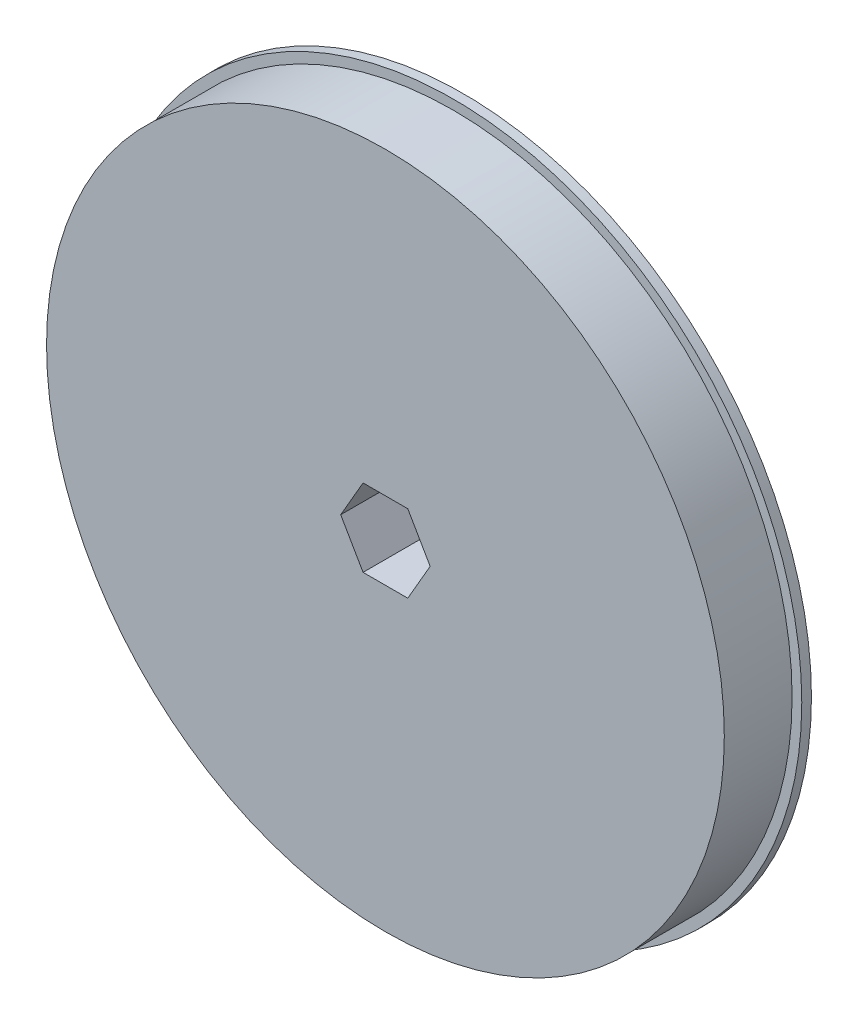
ISO-10303-21;
HEADER;
FILE_DESCRIPTION(('STEP AP214'),'2;1');
FILE_NAME('part.step','',(''),(''),'','','');
FILE_SCHEMA(('AUTOMOTIVE_DESIGN { 1 0 10303 214 1 1 1 1 }'));
ENDSEC;
DATA;
#1=APPLICATION_CONTEXT('core data for automotive mechanical design processes');
#2=APPLICATION_PROTOCOL_DEFINITION('international standard','automotive_design',2000,#1);
#3=PRODUCT_CONTEXT('',#1,'mechanical');
#4=PRODUCT('Part','Part','',(#3));
#5=PRODUCT_RELATED_PRODUCT_CATEGORY('part','',(#4));
#6=PRODUCT_DEFINITION_FORMATION('','',#4);
#7=PRODUCT_DEFINITION_CONTEXT('part definition',#1,'design');
#8=PRODUCT_DEFINITION('design','',#6,#7);
#9=PRODUCT_DEFINITION_SHAPE('','',#8);
#10=(LENGTH_UNIT() NAMED_UNIT(*) SI_UNIT(.MILLI.,.METRE.));
#11=(NAMED_UNIT(*) PLANE_ANGLE_UNIT() SI_UNIT($,.RADIAN.));
#12=(NAMED_UNIT(*) SI_UNIT($,.STERADIAN.) SOLID_ANGLE_UNIT());
#13=UNCERTAINTY_MEASURE_WITH_UNIT(LENGTH_MEASURE(1.E-05),#10,'distance_accuracy_value','');
#14=(GEOMETRIC_REPRESENTATION_CONTEXT(3) GLOBAL_UNCERTAINTY_ASSIGNED_CONTEXT((#13)) GLOBAL_UNIT_ASSIGNED_CONTEXT((#10,
#11,#12)) REPRESENTATION_CONTEXT('',''));
#15=CARTESIAN_POINT('',(0.,0.,0.));
#16=DIRECTION('',(0.,0.,1.));
#17=DIRECTION('',(1.,0.,0.));
#18=AXIS2_PLACEMENT_3D('',#15,#16,#17);
#19=CARTESIAN_POINT('',(0.,0.,9.525));
#20=DIRECTION('',(0.,0.,-1.));
#21=DIRECTION('',(-1.,0.,0.));
#22=AXIS2_PLACEMENT_3D('',#19,#20,#21);
#23=PLANE('',#22);
#24=CARTESIAN_POINT('',(0.,0.,9.525));
#25=DIRECTION('',(0.,0.,-1.));
#26=DIRECTION('',(-1.,0.,0.));
#27=AXIS2_PLACEMENT_3D('',#24,#25,#26);
#28=CIRCLE('',#27,50.8);
#29=CARTESIAN_POINT('',(-50.8,0.,9.525));
#30=VERTEX_POINT('',#29);
#31=EDGE_CURVE('E142',#30,#30,#28,.T.);
#32=ORIENTED_EDGE('',*,*,#31,.T.);
#33=EDGE_LOOP('',(#32));
#34=FACE_BOUND('',#33,.T.);
#35=CARTESIAN_POINT('',(0.,0.,9.525));
#36=DIRECTION('',(0.,0.,-1.));
#37=DIRECTION('',(-1.,0.,0.));
#38=AXIS2_PLACEMENT_3D('',#35,#36,#37);
#39=CIRCLE('',#38,12.7);
#40=CARTESIAN_POINT('',(12.7,0.,9.525));
#41=VERTEX_POINT('',#40);
#42=EDGE_CURVE('E131',#41,#41,#39,.T.);
#43=ORIENTED_EDGE('',*,*,#42,.F.);
#44=EDGE_LOOP('',(#43));
#45=FACE_BOUND('',#44,.T.);
#46=ADVANCED_FACE('F33',(#34,#45),#23,.T.);
#47=CARTESIAN_POINT('',(0.,0.,12.7));
#48=DIRECTION('',(0.,0.,-1.));
#49=DIRECTION('',(-1.,0.,0.));
#50=AXIS2_PLACEMENT_3D('',#47,#48,#49);
#51=CYLINDRICAL_SURFACE('',#50,57.15);
#52=CARTESIAN_POINT('',(0.,0.,0.));
#53=DIRECTION('',(0.,0.,1.));
#54=DIRECTION('',(1.,0.,0.));
#55=AXIS2_PLACEMENT_3D('',#52,#53,#54);
#56=CIRCLE('',#55,57.15);
#57=CARTESIAN_POINT('',(57.15,0.,0.));
#58=VERTEX_POINT('',#57);
#59=EDGE_CURVE('E156',#58,#58,#56,.T.);
#60=ORIENTED_EDGE('',*,*,#59,.T.);
#61=EDGE_LOOP('',(#60));
#62=FACE_BOUND('',#61,.T.);
#63=CARTESIAN_POINT('',(0.,0.,1.5875));
#64=DIRECTION('',(0.,0.,1.));
#65=DIRECTION('',(1.,0.,0.));
#66=AXIS2_PLACEMENT_3D('',#63,#64,#65);
#67=CIRCLE('',#66,57.15);
#68=CARTESIAN_POINT('',(57.15,0.,1.5875));
#69=VERTEX_POINT('',#68);
#70=EDGE_CURVE('E151',#69,#69,#67,.T.);
#71=ORIENTED_EDGE('',*,*,#70,.F.);
#72=EDGE_LOOP('',(#71));
#73=FACE_BOUND('',#72,.T.);
#74=ADVANCED_FACE('F173',(#62,#73),#51,.T.);
#75=CARTESIAN_POINT('',(0.,0.,0.));
#76=DIRECTION('',(0.,0.,1.));
#77=DIRECTION('',(1.,0.,0.));
#78=AXIS2_PLACEMENT_3D('',#75,#76,#77);
#79=PLANE('',#78);
#80=CARTESIAN_POINT('',(0.,0.,0.));
#81=DIRECTION('',(0.,0.,-1.));
#82=DIRECTION('',(-1.,0.,0.));
#83=AXIS2_PLACEMENT_3D('',#80,#81,#82);
#84=CIRCLE('',#83,50.8);
#85=CARTESIAN_POINT('',(-50.8,0.,0.));
#86=VERTEX_POINT('',#85);
#87=EDGE_CURVE('E141',#86,#86,#84,.T.);
#88=ORIENTED_EDGE('',*,*,#87,.F.);
#89=EDGE_LOOP('',(#88));
#90=FACE_BOUND('',#89,.T.);
#91=ORIENTED_EDGE('',*,*,#59,.F.);
#92=EDGE_LOOP('',(#91));
#93=FACE_BOUND('',#92,.T.);
#94=ADVANCED_FACE('F179',(#90,#93),#79,.F.);
#95=CARTESIAN_POINT('',(0.,0.,1.5875));
#96=DIRECTION('',(0.,0.,1.));
#97=DIRECTION('',(1.,0.,0.));
#98=AXIS2_PLACEMENT_3D('',#95,#96,#97);
#99=PLANE('',#98);
#100=CARTESIAN_POINT('',(0.,0.,1.5875));
#101=DIRECTION('',(0.,0.,1.));
#102=DIRECTION('',(1.,0.,0.));
#103=AXIS2_PLACEMENT_3D('',#100,#101,#102);
#104=CIRCLE('',#103,55.5625);
#105=CARTESIAN_POINT('',(55.5625,0.,1.5875));
#106=VERTEX_POINT('',#105);
#107=EDGE_CURVE('E148',#106,#106,#104,.T.);
#108=ORIENTED_EDGE('',*,*,#107,.F.);
#109=EDGE_LOOP('',(#108));
#110=FACE_BOUND('',#109,.T.);
#111=ORIENTED_EDGE('',*,*,#70,.T.);
#112=EDGE_LOOP('',(#111));
#113=FACE_BOUND('',#112,.T.);
#114=ADVANCED_FACE('F193',(#110,#113),#99,.T.);
#115=CARTESIAN_POINT('',(0.,0.,1.5875));
#116=DIRECTION('',(0.,0.,1.));
#117=DIRECTION('',(1.,0.,0.));
#118=AXIS2_PLACEMENT_3D('',#115,#116,#117);
#119=CYLINDRICAL_SURFACE('',#118,55.5625);
#120=ORIENTED_EDGE('',*,*,#107,.T.);
#121=EDGE_LOOP('',(#120));
#122=FACE_BOUND('',#121,.T.);
#123=CARTESIAN_POINT('',(0.,0.,12.7));
#124=DIRECTION('',(0.,0.,1.));
#125=DIRECTION('',(1.,0.,0.));
#126=AXIS2_PLACEMENT_3D('',#123,#124,#125);
#127=CIRCLE('',#126,55.5625);
#128=CARTESIAN_POINT('',(55.5625,0.,12.7));
#129=VERTEX_POINT('',#128);
#130=EDGE_CURVE('E145',#129,#129,#127,.T.);
#131=ORIENTED_EDGE('',*,*,#130,.F.);
#132=EDGE_LOOP('',(#131));
#133=FACE_BOUND('',#132,.T.);
#134=ADVANCED_FACE('F190',(#122,#133),#119,.T.);
#135=CARTESIAN_POINT('',(0.,0.,12.7));
#136=DIRECTION('',(0.,0.,1.));
#137=DIRECTION('',(1.,0.,0.));
#138=AXIS2_PLACEMENT_3D('',#135,#136,#137);
#139=PLANE('',#138);
#140=DIRECTION('',(-0.5,0.866025403784439,0.));
#141=VECTOR('',#140,1.);
#142=CARTESIAN_POINT('',(-3.66617420935412,-6.35,12.7));
#143=LINE('',#142,#141);
#144=CARTESIAN_POINT('',(-3.66617420935412,-6.35,12.7));
#145=VERTEX_POINT('',#144);
#146=CARTESIAN_POINT('',(-7.33234841870825,0.,12.7));
#147=VERTEX_POINT('',#146);
#148=EDGE_CURVE('E88',#145,#147,#143,.T.);
#149=ORIENTED_EDGE('',*,*,#148,.T.);
#150=DIRECTION('',(0.5,0.866025403784439,0.));
#151=VECTOR('',#150,1.);
#152=CARTESIAN_POINT('',(-7.33234841870825,0.,12.7));
#153=LINE('',#152,#151);
#154=CARTESIAN_POINT('',(-3.66617420935412,6.35,12.7));
#155=VERTEX_POINT('',#154);
#156=EDGE_CURVE('E97',#147,#155,#153,.T.);
#157=ORIENTED_EDGE('',*,*,#156,.T.);
#158=DIRECTION('',(1.,0.,0.));
#159=VECTOR('',#158,1.);
#160=CARTESIAN_POINT('',(-3.66617420935412,6.35,12.7));
#161=LINE('',#160,#159);
#162=CARTESIAN_POINT('',(3.66617420935412,6.35000000000001,12.7));
#163=VERTEX_POINT('',#162);
#164=EDGE_CURVE('E48',#155,#163,#161,.T.);
#165=ORIENTED_EDGE('',*,*,#164,.T.);
#166=DIRECTION('',(0.5,-0.866025403784439,0.));
#167=VECTOR('',#166,1.);
#168=CARTESIAN_POINT('',(3.66617420935412,6.35000000000001,12.7));
#169=LINE('',#168,#167);
#170=CARTESIAN_POINT('',(7.33234841870825,0.,12.7));
#171=VERTEX_POINT('',#170);
#172=EDGE_CURVE('E112',#163,#171,#169,.T.);
#173=ORIENTED_EDGE('',*,*,#172,.T.);
#174=DIRECTION('',(-0.5,-0.866025403784439,0.));
#175=VECTOR('',#174,1.);
#176=CARTESIAN_POINT('',(7.33234841870825,0.,12.7));
#177=LINE('',#176,#175);
#178=CARTESIAN_POINT('',(3.66617420935413,-6.35,12.7));
#179=VERTEX_POINT('',#178);
#180=EDGE_CURVE('E115',#171,#179,#177,.T.);
#181=ORIENTED_EDGE('',*,*,#180,.T.);
#182=DIRECTION('',(-1.,0.,0.));
#183=VECTOR('',#182,1.);
#184=CARTESIAN_POINT('',(3.66617420935413,-6.35,12.7));
#185=LINE('',#184,#183);
#186=EDGE_CURVE('E94',#179,#145,#185,.T.);
#187=ORIENTED_EDGE('',*,*,#186,.T.);
#188=EDGE_LOOP('',(#149,#157,#165,#173,#181,#187));
#189=FACE_BOUND('',#188,.T.);
#190=ORIENTED_EDGE('',*,*,#130,.T.);
#191=EDGE_LOOP('',(#190));
#192=FACE_BOUND('',#191,.T.);
#193=ADVANCED_FACE('F101',(#189,#192),#139,.T.);
#194=CARTESIAN_POINT('',(0.,0.,9.525));
#195=DIRECTION('',(0.,0.,-1.));
#196=DIRECTION('',(-1.,0.,0.));
#197=AXIS2_PLACEMENT_3D('',#194,#195,#196);
#198=CYLINDRICAL_SURFACE('',#197,50.8);
#199=CARTESIAN_POINT('',(-50.8,0.,9.525));
#200=CARTESIAN_POINT('',(-50.8,0.,9.42578125));
#201=CARTESIAN_POINT('',(-50.8,0.,9.3265625));
#202=CARTESIAN_POINT('',(-50.8,0.,9.128125));
#203=CARTESIAN_POINT('',(-50.8,0.,9.02890625));
#204=CARTESIAN_POINT('',(-50.8,0.,8.83046875));
#205=CARTESIAN_POINT('',(-50.8,0.,8.73125));
#206=CARTESIAN_POINT('',(-50.8,0.,8.5328125));
#207=CARTESIAN_POINT('',(-50.8,0.,8.43359375));
#208=CARTESIAN_POINT('',(-50.8,0.,8.23515625));
#209=CARTESIAN_POINT('',(-50.8,0.,8.1359375));
#210=CARTESIAN_POINT('',(-50.8,0.,7.9375));
#211=CARTESIAN_POINT('',(-50.8,0.,7.83828125));
#212=CARTESIAN_POINT('',(-50.8,0.,7.63984375));
#213=CARTESIAN_POINT('',(-50.8,0.,7.540625));
#214=CARTESIAN_POINT('',(-50.8,0.,7.3421875));
#215=CARTESIAN_POINT('',(-50.8,0.,7.24296875));
#216=CARTESIAN_POINT('',(-50.8,0.,7.04453125));
#217=CARTESIAN_POINT('',(-50.8,0.,6.9453125));
#218=CARTESIAN_POINT('',(-50.8,0.,6.746875));
#219=CARTESIAN_POINT('',(-50.8,0.,6.64765625));
#220=CARTESIAN_POINT('',(-50.8,0.,6.44921875));
#221=CARTESIAN_POINT('',(-50.8,0.,6.35));
#222=CARTESIAN_POINT('',(-50.8,0.,6.1515625));
#223=CARTESIAN_POINT('',(-50.8,0.,6.05234375));
#224=CARTESIAN_POINT('',(-50.8,0.,5.85390625));
#225=CARTESIAN_POINT('',(-50.8,0.,5.7546875));
#226=CARTESIAN_POINT('',(-50.8,0.,5.55625));
#227=CARTESIAN_POINT('',(-50.8,0.,5.45703125));
#228=CARTESIAN_POINT('',(-50.8,0.,5.25859375));
#229=CARTESIAN_POINT('',(-50.8,0.,5.159375));
#230=CARTESIAN_POINT('',(-50.8,0.,4.9609375));
#231=CARTESIAN_POINT('',(-50.8,0.,4.86171875));
#232=CARTESIAN_POINT('',(-50.8,0.,4.66328125));
#233=CARTESIAN_POINT('',(-50.8,0.,4.5640625));
#234=CARTESIAN_POINT('',(-50.8,0.,4.365625));
#235=CARTESIAN_POINT('',(-50.8,0.,4.26640625));
#236=CARTESIAN_POINT('',(-50.8,0.,4.06796875));
#237=CARTESIAN_POINT('',(-50.8,0.,3.96875));
#238=CARTESIAN_POINT('',(-50.8,0.,3.7703125));
#239=CARTESIAN_POINT('',(-50.8,0.,3.67109375));
#240=CARTESIAN_POINT('',(-50.8,0.,3.47265625));
#241=CARTESIAN_POINT('',(-50.8,0.,3.3734375));
#242=CARTESIAN_POINT('',(-50.8,0.,3.175));
#243=CARTESIAN_POINT('',(-50.8,0.,3.07578125));
#244=CARTESIAN_POINT('',(-50.8,0.,2.87734375));
#245=CARTESIAN_POINT('',(-50.8,0.,2.778125));
#246=CARTESIAN_POINT('',(-50.8,0.,2.5796875));
#247=CARTESIAN_POINT('',(-50.8,0.,2.48046875));
#248=CARTESIAN_POINT('',(-50.8,0.,2.28203125));
#249=CARTESIAN_POINT('',(-50.8,0.,2.1828125));
#250=CARTESIAN_POINT('',(-50.8,0.,1.984375));
#251=CARTESIAN_POINT('',(-50.8,0.,1.88515625));
#252=CARTESIAN_POINT('',(-50.8,0.,1.68671875));
#253=CARTESIAN_POINT('',(-50.8,0.,1.5875));
#254=CARTESIAN_POINT('',(-50.8,0.,1.3890625));
#255=CARTESIAN_POINT('',(-50.8,0.,1.28984375));
#256=CARTESIAN_POINT('',(-50.8,0.,1.09140625));
#257=CARTESIAN_POINT('',(-50.8,0.,0.992187500000001));
#258=CARTESIAN_POINT('',(-50.8,0.,0.793750000000001));
#259=CARTESIAN_POINT('',(-50.8,0.,0.69453125));
#260=CARTESIAN_POINT('',(-50.8,0.,0.49609375));
#261=CARTESIAN_POINT('',(-50.8,0.,0.396875));
#262=CARTESIAN_POINT('',(-50.8,0.,0.1984375));
#263=CARTESIAN_POINT('',(-50.8,0.,0.0992187500000001));
#264=CARTESIAN_POINT('',(-50.8,0.,0.));
#265=B_SPLINE_CURVE_WITH_KNOTS('',3,(#199,#200,#201,#202,#203,#204,#205,#206,#207,#208,#209,
#210,#211,#212,#213,#214,#215,#216,#217,#218,#219,#220,#221,#222,#223,#224,#225,#226,#227,#228,
#229,#230,#231,#232,#233,#234,#235,#236,#237,#238,#239,#240,#241,#242,#243,#244,#245,#246,#247,
#248,#249,#250,#251,#252,#253,#254,#255,#256,#257,#258,#259,#260,#261,#262,#263,#264),
.UNSPECIFIED.,.F.,.F.,(4,2,2,2,2,2,2,2,2,2,2,2,2,2,2,2,2,2,2,2,2,2,2,2,2,2,2,2,2,2,2,2,4),(0.,
0.29765625,0.5953125,0.892968750000001,1.190625,1.48828125,1.7859375,2.08359375,2.38125,
2.67890625,2.9765625,3.27421875,3.571875,3.86953125,4.1671875,4.46484375,4.7625,5.06015625,
5.3578125,5.65546875,5.953125,6.25078125,6.5484375,6.84609375,7.14375,7.44140625,7.7390625,
8.03671875,8.334375,8.63203125,8.9296875,9.22734375,9.525),.UNSPECIFIED.);
#266=EDGE_CURVE('BSEAM186',#30,#86,#265,.T.);
#267=ORIENTED_EDGE('',*,*,#31,.F.);
#268=ORIENTED_EDGE('',*,*,#87,.T.);
#269=ORIENTED_EDGE('',*,*,#266,.T.);
#270=ORIENTED_EDGE('',*,*,#266,.F.);
#271=EDGE_LOOP('',(#267,#269,#268,#270));
#272=FACE_BOUND('',#271,.T.);
#273=ADVANCED_FACE('F186',(#272),#198,.F.);
#274=CARTESIAN_POINT('',(0.,0.,0.));
#275=DIRECTION('',(0.,0.,1.));
#276=DIRECTION('',(1.,0.,0.));
#277=AXIS2_PLACEMENT_3D('',#274,#275,#276);
#278=CYLINDRICAL_SURFACE('',#277,12.7);
#279=CARTESIAN_POINT('',(0.,0.,0.793749999999937));
#280=DIRECTION('',(0.,0.,-1.));
#281=DIRECTION('',(-1.,0.,0.));
#282=AXIS2_PLACEMENT_3D('',#279,#280,#281);
#283=CIRCLE('',#282,12.7);
#284=CARTESIAN_POINT('',(12.7,0.,0.793749999999937));
#285=VERTEX_POINT('',#284);
#286=EDGE_CURVE('E11',#285,#285,#283,.F.);
#287=CARTESIAN_POINT('',(12.7,0.,0.793749999999937));
#288=CARTESIAN_POINT('',(12.7,0.,0.884700520833271));
#289=CARTESIAN_POINT('',(12.7,0.,0.975651041666605));
#290=CARTESIAN_POINT('',(12.7,0.,1.15755208333327));
#291=CARTESIAN_POINT('',(12.7,0.,1.24850260416661));
#292=CARTESIAN_POINT('',(12.7,0.,1.43040364583327));
#293=CARTESIAN_POINT('',(12.7,0.,1.52135416666661));
#294=CARTESIAN_POINT('',(12.7,0.,1.70325520833328));
#295=CARTESIAN_POINT('',(12.7,0.,1.79420572916661));
#296=CARTESIAN_POINT('',(12.7,0.,1.97610677083328));
#297=CARTESIAN_POINT('',(12.7,0.,2.06705729166661));
#298=CARTESIAN_POINT('',(12.7,0.,2.24895833333328));
#299=CARTESIAN_POINT('',(12.7,0.,2.33990885416662));
#300=CARTESIAN_POINT('',(12.7,0.,2.52180989583328));
#301=CARTESIAN_POINT('',(12.7,0.,2.61276041666662));
#302=CARTESIAN_POINT('',(12.7,0.,2.79466145833328));
#303=CARTESIAN_POINT('',(12.7,0.,2.88561197916662));
#304=CARTESIAN_POINT('',(12.7,0.,3.06751302083329));
#305=CARTESIAN_POINT('',(12.7,0.,3.15846354166662));
#306=CARTESIAN_POINT('',(12.7,0.,3.34036458333329));
#307=CARTESIAN_POINT('',(12.7,0.,3.43131510416662));
#308=CARTESIAN_POINT('',(12.7,0.,3.61321614583329));
#309=CARTESIAN_POINT('',(12.7,0.,3.70416666666663));
#310=CARTESIAN_POINT('',(12.7,0.,3.88606770833329));
#311=CARTESIAN_POINT('',(12.7,0.,3.97701822916663));
#312=CARTESIAN_POINT('',(12.7,0.,4.15891927083329));
#313=CARTESIAN_POINT('',(12.7,0.,4.24986979166663));
#314=CARTESIAN_POINT('',(12.7,0.,4.4317708333333));
#315=CARTESIAN_POINT('',(12.7,0.,4.52272135416663));
#316=CARTESIAN_POINT('',(12.7,0.,4.7046223958333));
#317=CARTESIAN_POINT('',(12.7,0.,4.79557291666663));
#318=CARTESIAN_POINT('',(12.7,0.,4.9774739583333));
#319=CARTESIAN_POINT('',(12.7,0.,5.06842447916663));
#320=CARTESIAN_POINT('',(12.7,0.,5.2503255208333));
#321=CARTESIAN_POINT('',(12.7,0.,5.34127604166664));
#322=CARTESIAN_POINT('',(12.7,0.,5.52317708333331));
#323=CARTESIAN_POINT('',(12.7,0.,5.61412760416664));
#324=CARTESIAN_POINT('',(12.7,0.,5.79602864583331));
#325=CARTESIAN_POINT('',(12.7,0.,5.88697916666664));
#326=CARTESIAN_POINT('',(12.7,0.,6.06888020833331));
#327=CARTESIAN_POINT('',(12.7,0.,6.15983072916664));
#328=CARTESIAN_POINT('',(12.7,0.,6.34173177083331));
#329=CARTESIAN_POINT('',(12.7,0.,6.43268229166665));
#330=CARTESIAN_POINT('',(12.7,0.,6.61458333333331));
#331=CARTESIAN_POINT('',(12.7,0.,6.70553385416665));
#332=CARTESIAN_POINT('',(12.7,0.,6.88743489583331));
#333=CARTESIAN_POINT('',(12.7,0.,6.97838541666665));
#334=CARTESIAN_POINT('',(12.7,0.,7.16028645833332));
#335=CARTESIAN_POINT('',(12.7,0.,7.25123697916665));
#336=CARTESIAN_POINT('',(12.7,0.,7.43313802083332));
#337=CARTESIAN_POINT('',(12.7,0.,7.52408854166665));
#338=CARTESIAN_POINT('',(12.7,0.,7.70598958333332));
#339=CARTESIAN_POINT('',(12.7,0.,7.79694010416666));
#340=CARTESIAN_POINT('',(12.7,0.,7.97884114583332));
#341=CARTESIAN_POINT('',(12.7,0.,8.06979166666666));
#342=CARTESIAN_POINT('',(12.7,0.,8.25169270833332));
#343=CARTESIAN_POINT('',(12.7,0.,8.34264322916666));
#344=CARTESIAN_POINT('',(12.7,0.,8.52454427083333));
#345=CARTESIAN_POINT('',(12.7,0.,8.61549479166666));
#346=CARTESIAN_POINT('',(12.7,0.,8.79739583333333));
#347=CARTESIAN_POINT('',(12.7,0.,8.88834635416666));
#348=CARTESIAN_POINT('',(12.7,0.,9.07024739583333));
#349=CARTESIAN_POINT('',(12.7,0.,9.16119791666666));
#350=CARTESIAN_POINT('',(12.7,0.,9.34309895833333));
#351=CARTESIAN_POINT('',(12.7,0.,9.43404947916667));
#352=CARTESIAN_POINT('',(12.7,0.,9.525));
#353=B_SPLINE_CURVE_WITH_KNOTS('',3,(#287,#288,#289,#290,#291,#292,#293,#294,#295,#296,#297,
#298,#299,#300,#301,#302,#303,#304,#305,#306,#307,#308,#309,#310,#311,#312,#313,#314,#315,#316,
#317,#318,#319,#320,#321,#322,#323,#324,#325,#326,#327,#328,#329,#330,#331,#332,#333,#334,#335,
#336,#337,#338,#339,#340,#341,#342,#343,#344,#345,#346,#347,#348,#349,#350,#351,#352),
.UNSPECIFIED.,.F.,.F.,(4,2,2,2,2,2,2,2,2,2,2,2,2,2,2,2,2,2,2,2,2,2,2,2,2,2,2,2,2,2,2,2,4),(0.,
0.272851562500002,0.545703125000004,0.818554687500006,1.09140625000001,1.36425781250001,
1.63710937500001,1.90996093750001,2.18281250000002,2.45566406250002,2.72851562500002,
3.00136718750002,3.27421875000002,3.54707031250003,3.81992187500003,4.09277343750003,
4.36562500000003,4.63847656250003,4.91132812500004,5.18417968750004,5.45703125000004,
5.72988281250004,6.00273437500004,6.27558593750005,6.54843750000005,6.82128906250005,
7.09414062500005,7.36699218750005,7.63984375000006,7.91269531250006,8.18554687500006,
8.45839843750006,8.73125000000006),.UNSPECIFIED.);
#354=EDGE_CURVE('BSEAM184',#285,#41,#353,.T.);
#355=ORIENTED_EDGE('',*,*,#286,.T.);
#356=ORIENTED_EDGE('',*,*,#42,.T.);
#357=ORIENTED_EDGE('',*,*,#354,.T.);
#358=ORIENTED_EDGE('',*,*,#354,.F.);
#359=EDGE_LOOP('',(#355,#357,#356,#358));
#360=FACE_BOUND('',#359,.T.);
#361=ADVANCED_FACE('F184',(#360),#278,.T.);
#362=CARTESIAN_POINT('',(0.,0.,0.));
#363=DIRECTION('',(0.,0.,-1.));
#364=DIRECTION('',(-1.,0.,0.));
#365=AXIS2_PLACEMENT_3D('',#362,#363,#364);
#366=PLANE('',#365);
#367=CARTESIAN_POINT('',(0.,0.,0.));
#368=DIRECTION('',(0.,0.,-1.));
#369=DIRECTION('',(-1.,0.,0.));
#370=AXIS2_PLACEMENT_3D('',#367,#368,#369);
#371=CIRCLE('',#370,11.9062500000001);
#372=CARTESIAN_POINT('',(-11.9062500000001,0.,0.));
#373=VERTEX_POINT('',#372);
#374=EDGE_CURVE('E41',#373,#373,#371,.T.);
#375=ORIENTED_EDGE('',*,*,#374,.T.);
#376=EDGE_LOOP('',(#375));
#377=FACE_BOUND('',#376,.T.);
#378=DIRECTION('',(-0.5,0.866025403784439,0.));
#379=VECTOR('',#378,1.);
#380=CARTESIAN_POINT('',(-3.66617420935412,-6.35,0.));
#381=LINE('',#380,#379);
#382=CARTESIAN_POINT('',(-3.66617420935412,-6.35,0.));
#383=VERTEX_POINT('',#382);
#384=CARTESIAN_POINT('',(-7.33234841870825,0.,0.));
#385=VERTEX_POINT('',#384);
#386=EDGE_CURVE('E56',#383,#385,#381,.T.);
#387=ORIENTED_EDGE('',*,*,#386,.F.);
#388=DIRECTION('',(-1.,0.,0.));
#389=VECTOR('',#388,1.);
#390=CARTESIAN_POINT('',(3.66617420935413,-6.35,0.));
#391=LINE('',#390,#389);
#392=CARTESIAN_POINT('',(3.66617420935413,-6.35,0.));
#393=VERTEX_POINT('',#392);
#394=EDGE_CURVE('E105',#393,#383,#391,.T.);
#395=ORIENTED_EDGE('',*,*,#394,.F.);
#396=DIRECTION('',(-0.5,-0.866025403784439,0.));
#397=VECTOR('',#396,1.);
#398=CARTESIAN_POINT('',(7.33234841870825,0.,0.));
#399=LINE('',#398,#397);
#400=CARTESIAN_POINT('',(7.33234841870825,0.,0.));
#401=VERTEX_POINT('',#400);
#402=EDGE_CURVE('E108',#401,#393,#399,.T.);
#403=ORIENTED_EDGE('',*,*,#402,.F.);
#404=DIRECTION('',(0.5,-0.866025403784439,0.));
#405=VECTOR('',#404,1.);
#406=CARTESIAN_POINT('',(3.66617420935412,6.35000000000001,0.));
#407=LINE('',#406,#405);
#408=CARTESIAN_POINT('',(3.66617420935412,6.35000000000001,0.));
#409=VERTEX_POINT('',#408);
#410=EDGE_CURVE('E124',#409,#401,#407,.T.);
#411=ORIENTED_EDGE('',*,*,#410,.F.);
#412=DIRECTION('',(1.,0.,0.));
#413=VECTOR('',#412,1.);
#414=CARTESIAN_POINT('',(-3.66617420935412,6.35,0.));
#415=LINE('',#414,#413);
#416=CARTESIAN_POINT('',(-3.66617420935412,6.35,0.));
#417=VERTEX_POINT('',#416);
#418=EDGE_CURVE('E121',#417,#409,#415,.T.);
#419=ORIENTED_EDGE('',*,*,#418,.F.);
#420=DIRECTION('',(0.5,0.866025403784439,0.));
#421=VECTOR('',#420,1.);
#422=CARTESIAN_POINT('',(-7.33234841870825,0.,0.));
#423=LINE('',#422,#421);
#424=EDGE_CURVE('E119',#385,#417,#423,.T.);
#425=ORIENTED_EDGE('',*,*,#424,.F.);
#426=EDGE_LOOP('',(#387,#395,#403,#411,#419,#425));
#427=FACE_BOUND('',#426,.T.);
#428=ADVANCED_FACE('F161',(#377,#427),#366,.T.);
#429=CARTESIAN_POINT('',(-3.66617420935412,-6.35,12.7));
#430=DIRECTION('',(-0.866025403784439,-0.5,0.));
#431=DIRECTION('',(0.5,-0.866025403784439,0.));
#432=AXIS2_PLACEMENT_3D('',#429,#430,#431);
#433=PLANE('',#432);
#434=ORIENTED_EDGE('',*,*,#386,.T.);
#435=DIRECTION('',(0.,0.,-1.));
#436=VECTOR('',#435,1.);
#437=CARTESIAN_POINT('',(-7.33234841870825,0.,12.7));
#438=LINE('',#437,#436);
#439=EDGE_CURVE('E84',#147,#385,#438,.T.);
#440=ORIENTED_EDGE('',*,*,#439,.F.);
#441=ORIENTED_EDGE('',*,*,#148,.F.);
#442=DIRECTION('',(0.,0.,-1.));
#443=VECTOR('',#442,1.);
#444=CARTESIAN_POINT('',(-3.66617420935412,-6.35,12.7));
#445=LINE('',#444,#443);
#446=EDGE_CURVE('E129',#145,#383,#445,.T.);
#447=ORIENTED_EDGE('',*,*,#446,.T.);
#448=EDGE_LOOP('',(#434,#440,#441,#447));
#449=FACE_BOUND('',#448,.T.);
#450=ADVANCED_FACE('F86',(#449),#433,.F.);
#451=CARTESIAN_POINT('',(3.66617420935413,-6.35,12.7));
#452=DIRECTION('',(0.,-1.,0.));
#453=DIRECTION('',(1.,0.,0.));
#454=AXIS2_PLACEMENT_3D('',#451,#452,#453);
#455=PLANE('',#454);
#456=ORIENTED_EDGE('',*,*,#394,.T.);
#457=ORIENTED_EDGE('',*,*,#446,.F.);
#458=ORIENTED_EDGE('',*,*,#186,.F.);
#459=DIRECTION('',(0.,0.,-1.));
#460=VECTOR('',#459,1.);
#461=CARTESIAN_POINT('',(3.66617420935413,-6.35,12.7));
#462=LINE('',#461,#460);
#463=EDGE_CURVE('E132',#179,#393,#462,.T.);
#464=ORIENTED_EDGE('',*,*,#463,.T.);
#465=EDGE_LOOP('',(#456,#457,#458,#464));
#466=FACE_BOUND('',#465,.T.);
#467=ADVANCED_FACE('F247',(#466),#455,.F.);
#468=CARTESIAN_POINT('',(7.33234841870825,0.,12.7));
#469=DIRECTION('',(0.866025403784439,-0.5,0.));
#470=DIRECTION('',(0.5,0.866025403784439,0.));
#471=AXIS2_PLACEMENT_3D('',#468,#469,#470);
#472=PLANE('',#471);
#473=ORIENTED_EDGE('',*,*,#402,.T.);
#474=ORIENTED_EDGE('',*,*,#463,.F.);
#475=ORIENTED_EDGE('',*,*,#180,.F.);
#476=DIRECTION('',(0.,0.,-1.));
#477=VECTOR('',#476,1.);
#478=CARTESIAN_POINT('',(7.33234841870825,0.,12.7));
#479=LINE('',#478,#477);
#480=EDGE_CURVE('E134',#171,#401,#479,.T.);
#481=ORIENTED_EDGE('',*,*,#480,.T.);
#482=EDGE_LOOP('',(#473,#474,#475,#481));
#483=FACE_BOUND('',#482,.T.);
#484=ADVANCED_FACE('F254',(#483),#472,.F.);
#485=CARTESIAN_POINT('',(3.66617420935412,6.35000000000001,12.7));
#486=DIRECTION('',(0.866025403784439,0.5,0.));
#487=DIRECTION('',(-0.5,0.866025403784439,0.));
#488=AXIS2_PLACEMENT_3D('',#485,#486,#487);
#489=PLANE('',#488);
#490=ORIENTED_EDGE('',*,*,#410,.T.);
#491=ORIENTED_EDGE('',*,*,#480,.F.);
#492=ORIENTED_EDGE('',*,*,#172,.F.);
#493=DIRECTION('',(0.,0.,-1.));
#494=VECTOR('',#493,1.);
#495=CARTESIAN_POINT('',(3.66617420935412,6.35000000000001,12.7));
#496=LINE('',#495,#494);
#497=EDGE_CURVE('E136',#163,#409,#496,.T.);
#498=ORIENTED_EDGE('',*,*,#497,.T.);
#499=EDGE_LOOP('',(#490,#491,#492,#498));
#500=FACE_BOUND('',#499,.T.);
#501=ADVANCED_FACE('F262',(#500),#489,.F.);
#502=CARTESIAN_POINT('',(-3.66617420935412,6.35,12.7));
#503=DIRECTION('',(0.,1.,0.));
#504=DIRECTION('',(-1.,0.,0.));
#505=AXIS2_PLACEMENT_3D('',#502,#503,#504);
#506=PLANE('',#505);
#507=ORIENTED_EDGE('',*,*,#418,.T.);
#508=ORIENTED_EDGE('',*,*,#497,.F.);
#509=ORIENTED_EDGE('',*,*,#164,.F.);
#510=DIRECTION('',(0.,0.,-1.));
#511=VECTOR('',#510,1.);
#512=CARTESIAN_POINT('',(-3.66617420935412,6.35,12.7));
#513=LINE('',#512,#511);
#514=EDGE_CURVE('E93',#155,#417,#513,.T.);
#515=ORIENTED_EDGE('',*,*,#514,.T.);
#516=EDGE_LOOP('',(#507,#508,#509,#515));
#517=FACE_BOUND('',#516,.T.);
#518=ADVANCED_FACE('F169',(#517),#506,.F.);
#519=CARTESIAN_POINT('',(-7.33234841870825,0.,12.7));
#520=DIRECTION('',(-0.866025403784439,0.5,0.));
#521=DIRECTION('',(-0.5,-0.866025403784439,0.));
#522=AXIS2_PLACEMENT_3D('',#519,#520,#521);
#523=PLANE('',#522);
#524=ORIENTED_EDGE('',*,*,#424,.T.);
#525=ORIENTED_EDGE('',*,*,#514,.F.);
#526=ORIENTED_EDGE('',*,*,#156,.F.);
#527=ORIENTED_EDGE('',*,*,#439,.T.);
#528=EDGE_LOOP('',(#524,#525,#526,#527));
#529=FACE_BOUND('',#528,.T.);
#530=ADVANCED_FACE('F98',(#529),#523,.F.);
#531=CARTESIAN_POINT('',(0.,0.,0.));
#532=DIRECTION('',(0.,0.,1.));
#533=DIRECTION('',(1.,0.,0.));
#534=AXIS2_PLACEMENT_3D('',#531,#532,#533);
#535=CONICAL_SURFACE('',#534,11.9062500000001,0.785398163397449);
#536=ORIENTED_EDGE('',*,*,#286,.F.);
#537=EDGE_LOOP('',(#536));
#538=FACE_BOUND('',#537,.T.);
#539=ORIENTED_EDGE('',*,*,#374,.F.);
#540=EDGE_LOOP('',(#539));
#541=FACE_BOUND('',#540,.T.);
#542=ADVANCED_FACE('F35',(#538,#541),#535,.T.);
#543=CLOSED_SHELL('',(#46,#74,#94,#114,#134,#193,#273,#361,#428,#450,#467,#484,#501,#518,#530,#542));
#544=MANIFOLD_SOLID_BREP('B2',#543);
#545=ADVANCED_BREP_SHAPE_REPRESENTATION('',(#18,#544),#14);
#546=SHAPE_DEFINITION_REPRESENTATION(#9,#545);
ENDSEC;
END-ISO-10303-21;
